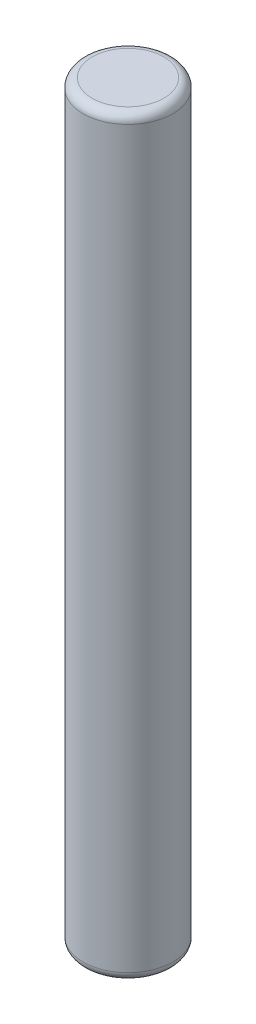
ISO-10303-21;
HEADER;
FILE_DESCRIPTION(('STEP AP214'),'2;1');
FILE_NAME('part.step','',(''),(''),'','','');
FILE_SCHEMA(('AUTOMOTIVE_DESIGN { 1 0 10303 214 1 1 1 1 }'));
ENDSEC;
DATA;
#1=APPLICATION_CONTEXT('core data for automotive mechanical design processes');
#2=APPLICATION_PROTOCOL_DEFINITION('international standard','automotive_design',2000,#1);
#3=PRODUCT_CONTEXT('',#1,'mechanical');
#4=PRODUCT('Part','Part','',(#3));
#5=PRODUCT_RELATED_PRODUCT_CATEGORY('part','',(#4));
#6=PRODUCT_DEFINITION_FORMATION('','',#4);
#7=PRODUCT_DEFINITION_CONTEXT('part definition',#1,'design');
#8=PRODUCT_DEFINITION('design','',#6,#7);
#9=PRODUCT_DEFINITION_SHAPE('','',#8);
#10=(LENGTH_UNIT() NAMED_UNIT(*) SI_UNIT(.MILLI.,.METRE.));
#11=(NAMED_UNIT(*) PLANE_ANGLE_UNIT() SI_UNIT($,.RADIAN.));
#12=(NAMED_UNIT(*) SI_UNIT($,.STERADIAN.) SOLID_ANGLE_UNIT());
#13=UNCERTAINTY_MEASURE_WITH_UNIT(LENGTH_MEASURE(1.E-05),#10,'distance_accuracy_value','');
#14=(GEOMETRIC_REPRESENTATION_CONTEXT(3) GLOBAL_UNCERTAINTY_ASSIGNED_CONTEXT((#13)) GLOBAL_UNIT_ASSIGNED_CONTEXT((#10,
#11,#12)) REPRESENTATION_CONTEXT('',''));
#15=CARTESIAN_POINT('',(0.,0.,0.));
#16=DIRECTION('',(0.,0.,1.));
#17=DIRECTION('',(1.,0.,0.));
#18=AXIS2_PLACEMENT_3D('',#15,#16,#17);
#19=CARTESIAN_POINT('',(0.,42.,0.));
#20=DIRECTION('',(0.,-1.,0.));
#21=DIRECTION('',(0.,0.,-1.));
#22=AXIS2_PLACEMENT_3D('',#19,#20,#21);
#23=CYLINDRICAL_SURFACE('',#22,2.5);
#24=CARTESIAN_POINT('',(0.,0.499999999999994,0.));
#25=DIRECTION('',(0.,1.,0.));
#26=DIRECTION('',(0.,0.,1.));
#27=AXIS2_PLACEMENT_3D('',#24,#25,#26);
#28=CIRCLE('',#27,2.5);
#29=CARTESIAN_POINT('',(0.,0.499999999999987,-2.5));
#30=VERTEX_POINT('',#29);
#31=EDGE_CURVE('E48',#30,#30,#28,.T.);
#32=CARTESIAN_POINT('',(0.,41.5,0.));
#33=DIRECTION('',(0.,1.,0.));
#34=DIRECTION('',(0.,0.,1.));
#35=AXIS2_PLACEMENT_3D('',#32,#33,#34);
#36=CIRCLE('',#35,2.5);
#37=CARTESIAN_POINT('',(0.,41.5,-2.5));
#38=VERTEX_POINT('',#37);
#39=EDGE_CURVE('E52',#38,#38,#36,.F.);
#40=CARTESIAN_POINT('',(0.,0.499999999999987,-2.5));
#41=CARTESIAN_POINT('',(0.,0.927083333333319,-2.5));
#42=CARTESIAN_POINT('',(0.,1.35416666666665,-2.5));
#43=CARTESIAN_POINT('',(0.,2.20833333333332,-2.5));
#44=CARTESIAN_POINT('',(0.,2.63541666666665,-2.5));
#45=CARTESIAN_POINT('',(0.,3.48958333333332,-2.5));
#46=CARTESIAN_POINT('',(0.,3.91666666666665,-2.5));
#47=CARTESIAN_POINT('',(0.,4.77083333333332,-2.5));
#48=CARTESIAN_POINT('',(0.,5.19791666666666,-2.5));
#49=CARTESIAN_POINT('',(0.,6.05208333333332,-2.5));
#50=CARTESIAN_POINT('',(0.,6.47916666666666,-2.5));
#51=CARTESIAN_POINT('',(0.,7.33333333333332,-2.5));
#52=CARTESIAN_POINT('',(0.,7.76041666666666,-2.5));
#53=CARTESIAN_POINT('',(0.,8.61458333333333,-2.5));
#54=CARTESIAN_POINT('',(0.,9.04166666666666,-2.5));
#55=CARTESIAN_POINT('',(0.,9.89583333333333,-2.5));
#56=CARTESIAN_POINT('',(0.,10.3229166666667,-2.5));
#57=CARTESIAN_POINT('',(0.,11.1770833333333,-2.5));
#58=CARTESIAN_POINT('',(0.,11.6041666666667,-2.5));
#59=CARTESIAN_POINT('',(0.,12.4583333333333,-2.5));
#60=CARTESIAN_POINT('',(0.,12.8854166666667,-2.5));
#61=CARTESIAN_POINT('',(0.,13.7395833333333,-2.5));
#62=CARTESIAN_POINT('',(0.,14.1666666666667,-2.5));
#63=CARTESIAN_POINT('',(0.,15.0208333333333,-2.5));
#64=CARTESIAN_POINT('',(0.,15.4479166666667,-2.5));
#65=CARTESIAN_POINT('',(0.,16.3020833333333,-2.5));
#66=CARTESIAN_POINT('',(0.,16.7291666666667,-2.5));
#67=CARTESIAN_POINT('',(0.,17.5833333333333,-2.5));
#68=CARTESIAN_POINT('',(0.,18.0104166666667,-2.5));
#69=CARTESIAN_POINT('',(0.,18.8645833333333,-2.5));
#70=CARTESIAN_POINT('',(0.,19.2916666666667,-2.5));
#71=CARTESIAN_POINT('',(0.,20.1458333333333,-2.5));
#72=CARTESIAN_POINT('',(0.,20.5729166666667,-2.5));
#73=CARTESIAN_POINT('',(0.,21.4270833333333,-2.5));
#74=CARTESIAN_POINT('',(0.,21.8541666666667,-2.5));
#75=CARTESIAN_POINT('',(0.,22.7083333333333,-2.5));
#76=CARTESIAN_POINT('',(0.,23.1354166666667,-2.5));
#77=CARTESIAN_POINT('',(0.,23.9895833333333,-2.5));
#78=CARTESIAN_POINT('',(0.,24.4166666666667,-2.5));
#79=CARTESIAN_POINT('',(0.,25.2708333333333,-2.5));
#80=CARTESIAN_POINT('',(0.,25.6979166666667,-2.5));
#81=CARTESIAN_POINT('',(0.,26.5520833333333,-2.5));
#82=CARTESIAN_POINT('',(0.,26.9791666666667,-2.5));
#83=CARTESIAN_POINT('',(0.,27.8333333333333,-2.5));
#84=CARTESIAN_POINT('',(0.,28.2604166666667,-2.5));
#85=CARTESIAN_POINT('',(0.,29.1145833333333,-2.5));
#86=CARTESIAN_POINT('',(0.,29.5416666666667,-2.5));
#87=CARTESIAN_POINT('',(0.,30.3958333333333,-2.5));
#88=CARTESIAN_POINT('',(0.,30.8229166666667,-2.5));
#89=CARTESIAN_POINT('',(0.,31.6770833333333,-2.5));
#90=CARTESIAN_POINT('',(0.,32.1041666666667,-2.5));
#91=CARTESIAN_POINT('',(0.,32.9583333333333,-2.5));
#92=CARTESIAN_POINT('',(0.,33.3854166666667,-2.5));
#93=CARTESIAN_POINT('',(0.,34.2395833333333,-2.5));
#94=CARTESIAN_POINT('',(0.,34.6666666666667,-2.5));
#95=CARTESIAN_POINT('',(0.,35.5208333333333,-2.5));
#96=CARTESIAN_POINT('',(0.,35.9479166666667,-2.5));
#97=CARTESIAN_POINT('',(0.,36.8020833333333,-2.5));
#98=CARTESIAN_POINT('',(0.,37.2291666666667,-2.5));
#99=CARTESIAN_POINT('',(0.,38.0833333333333,-2.5));
#100=CARTESIAN_POINT('',(0.,38.5104166666667,-2.5));
#101=CARTESIAN_POINT('',(0.,39.3645833333333,-2.5));
#102=CARTESIAN_POINT('',(0.,39.7916666666667,-2.5));
#103=CARTESIAN_POINT('',(0.,40.6458333333333,-2.5));
#104=CARTESIAN_POINT('',(0.,41.0729166666667,-2.5));
#105=CARTESIAN_POINT('',(0.,41.5,-2.5));
#106=B_SPLINE_CURVE_WITH_KNOTS('',3,(#40,#41,#42,#43,#44,#45,#46,#47,#48,#49,#50,#51,#52,#53,
#54,#55,#56,#57,#58,#59,#60,#61,#62,#63,#64,#65,#66,#67,#68,#69,#70,#71,#72,#73,#74,#75,#76,#77,
#78,#79,#80,#81,#82,#83,#84,#85,#86,#87,#88,#89,#90,#91,#92,#93,#94,#95,#96,#97,#98,#99,#100,
#101,#102,#103,#104,#105),.UNSPECIFIED.,.F.,.F.,(4,2,2,2,2,2,2,2,2,2,2,2,2,2,2,2,2,2,2,2,2,2,2,
2,2,2,2,2,2,2,2,2,4),(0.,1.28125,2.5625,3.84375,5.125,6.40625,7.68750000000001,8.96875000000001,
10.25,11.53125,12.8125,14.09375,15.375,16.65625,17.9375,19.21875,20.5,21.78125,23.0625,24.34375,
25.625,26.90625,28.1875,29.46875,30.75,32.03125,33.3125,34.59375,35.875,37.15625,38.4375,
39.71875,41.),.UNSPECIFIED.);
#107=EDGE_CURVE('BSEAM37',#30,#38,#106,.T.);
#108=ORIENTED_EDGE('',*,*,#31,.T.);
#109=ORIENTED_EDGE('',*,*,#39,.T.);
#110=ORIENTED_EDGE('',*,*,#107,.T.);
#111=ORIENTED_EDGE('',*,*,#107,.F.);
#112=EDGE_LOOP('',(#108,#110,#109,#111));
#113=FACE_BOUND('',#112,.T.);
#114=ADVANCED_FACE('F37',(#113),#23,.T.);
#115=CARTESIAN_POINT('',(0.,42.,0.));
#116=DIRECTION('',(0.,1.,0.));
#117=DIRECTION('',(0.,0.,1.));
#118=AXIS2_PLACEMENT_3D('',#115,#116,#117);
#119=PLANE('',#118);
#120=CARTESIAN_POINT('',(0.,42.,0.));
#121=DIRECTION('',(0.,1.,0.));
#122=DIRECTION('',(0.,0.,1.));
#123=AXIS2_PLACEMENT_3D('',#120,#121,#122);
#124=CIRCLE('',#123,2.);
#125=CARTESIAN_POINT('',(0.,42.,2.));
#126=VERTEX_POINT('',#125);
#127=EDGE_CURVE('E10',#126,#126,#124,.T.);
#128=ORIENTED_EDGE('',*,*,#127,.T.);
#129=EDGE_LOOP('',(#128));
#130=FACE_BOUND('',#129,.T.);
#131=ADVANCED_FACE('F68',(#130),#119,.T.);
#132=CARTESIAN_POINT('',(0.,0.,0.));
#133=DIRECTION('',(0.,1.,0.));
#134=DIRECTION('',(0.,0.,1.));
#135=AXIS2_PLACEMENT_3D('',#132,#133,#134);
#136=PLANE('',#135);
#137=CARTESIAN_POINT('',(0.,0.,0.));
#138=DIRECTION('',(0.,1.,0.));
#139=DIRECTION('',(0.,0.,1.));
#140=AXIS2_PLACEMENT_3D('',#137,#138,#139);
#141=CIRCLE('',#140,2.);
#142=CARTESIAN_POINT('',(0.,0.,2.));
#143=VERTEX_POINT('',#142);
#144=EDGE_CURVE('E44',#143,#143,#141,.F.);
#145=ORIENTED_EDGE('',*,*,#144,.T.);
#146=EDGE_LOOP('',(#145));
#147=FACE_BOUND('',#146,.T.);
#148=ADVANCED_FACE('F65',(#147),#136,.F.);
#149=CARTESIAN_POINT('',(0.,0.5,0.));
#150=DIRECTION('',(0.,1.,0.));
#151=DIRECTION('',(0.,0.,1.));
#152=AXIS2_PLACEMENT_3D('',#149,#150,#151);
#153=TOROIDAL_SURFACE('',#152,2.,0.5);
#154=ORIENTED_EDGE('',*,*,#144,.F.);
#155=EDGE_LOOP('',(#154));
#156=FACE_BOUND('',#155,.T.);
#157=ORIENTED_EDGE('',*,*,#31,.F.);
#158=EDGE_LOOP('',(#157));
#159=FACE_BOUND('',#158,.T.);
#160=ADVANCED_FACE('F61',(#156,#159),#153,.T.);
#161=CARTESIAN_POINT('',(0.,41.5,0.));
#162=DIRECTION('',(0.,1.,0.));
#163=DIRECTION('',(0.,0.,1.));
#164=AXIS2_PLACEMENT_3D('',#161,#162,#163);
#165=TOROIDAL_SURFACE('',#164,2.,0.5);
#166=ORIENTED_EDGE('',*,*,#39,.F.);
#167=EDGE_LOOP('',(#166));
#168=FACE_BOUND('',#167,.T.);
#169=ORIENTED_EDGE('',*,*,#127,.F.);
#170=EDGE_LOOP('',(#169));
#171=FACE_BOUND('',#170,.T.);
#172=ADVANCED_FACE('F39',(#168,#171),#165,.T.);
#173=CLOSED_SHELL('',(#114,#131,#148,#160,#172));
#174=MANIFOLD_SOLID_BREP('B2',#173);
#175=ADVANCED_BREP_SHAPE_REPRESENTATION('',(#18,#174),#14);
#176=SHAPE_DEFINITION_REPRESENTATION(#9,#175);
ENDSEC;
END-ISO-10303-21;
